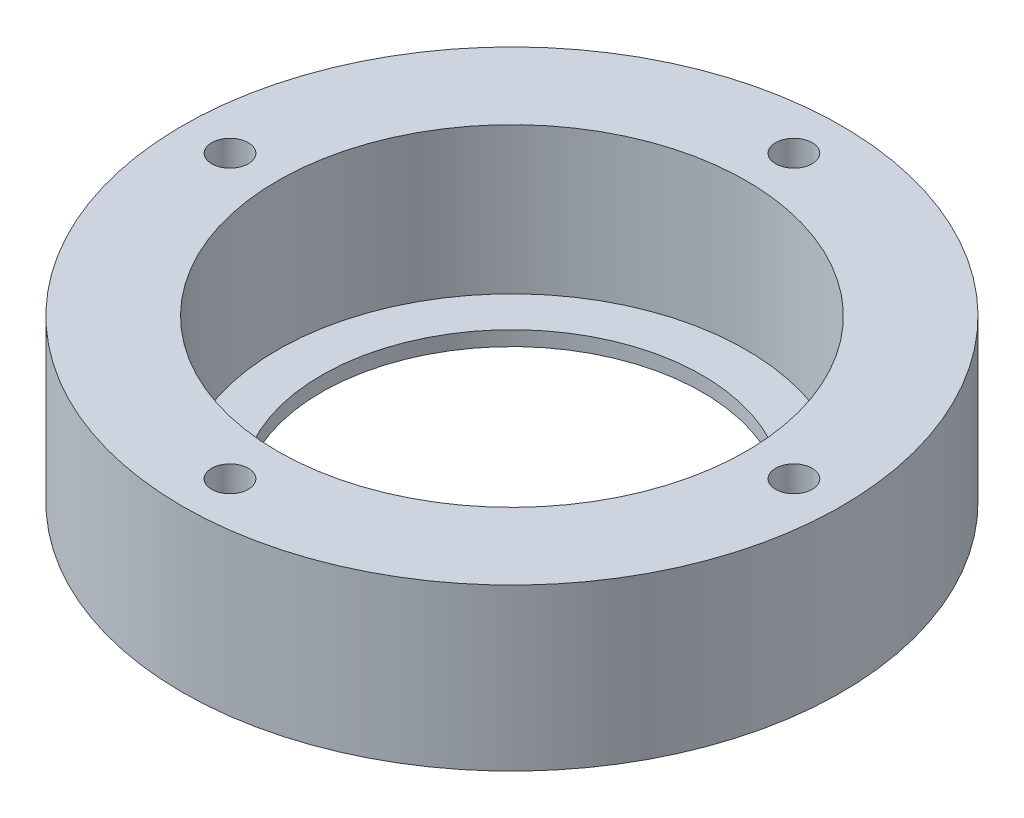
ISO-10303-21;
HEADER;
FILE_DESCRIPTION(('STEP AP214'),'2;1');
FILE_NAME('part.step','',(''),(''),'','','');
FILE_SCHEMA(('AUTOMOTIVE_DESIGN { 1 0 10303 214 1 1 1 1 }'));
ENDSEC;
DATA;
#1=APPLICATION_CONTEXT('core data for automotive mechanical design processes');
#2=APPLICATION_PROTOCOL_DEFINITION('international standard','automotive_design',2000,#1);
#3=PRODUCT_CONTEXT('',#1,'mechanical');
#4=PRODUCT('Part','Part','',(#3));
#5=PRODUCT_RELATED_PRODUCT_CATEGORY('part','',(#4));
#6=PRODUCT_DEFINITION_FORMATION('','',#4);
#7=PRODUCT_DEFINITION_CONTEXT('part definition',#1,'design');
#8=PRODUCT_DEFINITION('design','',#6,#7);
#9=PRODUCT_DEFINITION_SHAPE('','',#8);
#10=(LENGTH_UNIT() NAMED_UNIT(*) SI_UNIT(.MILLI.,.METRE.));
#11=(NAMED_UNIT(*) PLANE_ANGLE_UNIT() SI_UNIT($,.RADIAN.));
#12=(NAMED_UNIT(*) SI_UNIT($,.STERADIAN.) SOLID_ANGLE_UNIT());
#13=UNCERTAINTY_MEASURE_WITH_UNIT(LENGTH_MEASURE(1.E-05),#10,'distance_accuracy_value','');
#14=(GEOMETRIC_REPRESENTATION_CONTEXT(3) GLOBAL_UNCERTAINTY_ASSIGNED_CONTEXT((#13)) GLOBAL_UNIT_ASSIGNED_CONTEXT((#10,
#11,#12)) REPRESENTATION_CONTEXT('',''));
#15=CARTESIAN_POINT('',(0.,0.,0.));
#16=DIRECTION('',(0.,0.,1.));
#17=DIRECTION('',(1.,0.,0.));
#18=AXIS2_PLACEMENT_3D('',#15,#16,#17);
#19=CARTESIAN_POINT('',(0.,11.,0.));
#20=DIRECTION('',(0.,-1.,0.));
#21=DIRECTION('',(0.,0.,-1.));
#22=AXIS2_PLACEMENT_3D('',#19,#20,#21);
#23=CYLINDRICAL_SURFACE('',#22,22.5);
#24=CARTESIAN_POINT('',(0.,11.,0.));
#25=DIRECTION('',(0.,1.,0.));
#26=DIRECTION('',(0.,0.,1.));
#27=AXIS2_PLACEMENT_3D('',#24,#25,#26);
#28=CIRCLE('',#27,22.5);
#29=CARTESIAN_POINT('',(0.,11.,22.5));
#30=VERTEX_POINT('',#29);
#31=EDGE_CURVE('E11',#30,#30,#28,.T.);
#32=ORIENTED_EDGE('',*,*,#31,.F.);
#33=EDGE_LOOP('',(#32));
#34=FACE_BOUND('',#33,.T.);
#35=CARTESIAN_POINT('',(0.,0.,0.));
#36=DIRECTION('',(0.,1.,0.));
#37=DIRECTION('',(0.,0.,1.));
#38=AXIS2_PLACEMENT_3D('',#35,#36,#37);
#39=CIRCLE('',#38,22.5);
#40=CARTESIAN_POINT('',(0.,0.,22.5));
#41=VERTEX_POINT('',#40);
#42=EDGE_CURVE('E39',#41,#41,#39,.T.);
#43=ORIENTED_EDGE('',*,*,#42,.T.);
#44=EDGE_LOOP('',(#43));
#45=FACE_BOUND('',#44,.T.);
#46=ADVANCED_FACE('F36',(#34,#45),#23,.T.);
#47=CARTESIAN_POINT('',(0.,11.,0.));
#48=DIRECTION('',(0.,1.,0.));
#49=DIRECTION('',(0.,0.,1.));
#50=AXIS2_PLACEMENT_3D('',#47,#48,#49);
#51=PLANE('',#50);
#52=CARTESIAN_POINT('',(-19.25,11.,0.));
#53=DIRECTION('',(0.,1.,0.));
#54=DIRECTION('',(0.,0.,1.));
#55=AXIS2_PLACEMENT_3D('',#52,#53,#54);
#56=CIRCLE('',#55,1.25);
#57=CARTESIAN_POINT('',(-19.25,11.,1.25));
#58=VERTEX_POINT('',#57);
#59=EDGE_CURVE('E67',#58,#58,#56,.T.);
#60=ORIENTED_EDGE('',*,*,#59,.F.);
#61=EDGE_LOOP('',(#60));
#62=FACE_BOUND('',#61,.T.);
#63=CARTESIAN_POINT('',(0.,11.,19.25));
#64=DIRECTION('',(0.,1.,0.));
#65=DIRECTION('',(0.,0.,1.));
#66=AXIS2_PLACEMENT_3D('',#63,#64,#65);
#67=CIRCLE('',#66,1.25);
#68=CARTESIAN_POINT('',(0.,11.,20.5));
#69=VERTEX_POINT('',#68);
#70=EDGE_CURVE('E66',#69,#69,#67,.T.);
#71=ORIENTED_EDGE('',*,*,#70,.F.);
#72=EDGE_LOOP('',(#71));
#73=FACE_BOUND('',#72,.T.);
#74=CARTESIAN_POINT('',(19.25,11.,0.));
#75=DIRECTION('',(0.,1.,0.));
#76=DIRECTION('',(0.,0.,1.));
#77=AXIS2_PLACEMENT_3D('',#74,#75,#76);
#78=CIRCLE('',#77,1.25);
#79=CARTESIAN_POINT('',(19.25,11.,1.25));
#80=VERTEX_POINT('',#79);
#81=EDGE_CURVE('E77',#80,#80,#78,.T.);
#82=ORIENTED_EDGE('',*,*,#81,.F.);
#83=EDGE_LOOP('',(#82));
#84=FACE_BOUND('',#83,.T.);
#85=CARTESIAN_POINT('',(0.,11.,-19.25));
#86=DIRECTION('',(0.,1.,0.));
#87=DIRECTION('',(0.,0.,1.));
#88=AXIS2_PLACEMENT_3D('',#85,#86,#87);
#89=CIRCLE('',#88,1.25);
#90=CARTESIAN_POINT('',(0.,11.,-18.));
#91=VERTEX_POINT('',#90);
#92=EDGE_CURVE('E83',#91,#91,#89,.T.);
#93=ORIENTED_EDGE('',*,*,#92,.F.);
#94=EDGE_LOOP('',(#93));
#95=FACE_BOUND('',#94,.T.);
#96=CARTESIAN_POINT('',(0.,11.,0.));
#97=DIRECTION('',(0.,1.,0.));
#98=DIRECTION('',(0.,0.,1.));
#99=AXIS2_PLACEMENT_3D('',#96,#97,#98);
#100=CIRCLE('',#99,16.);
#101=CARTESIAN_POINT('',(0.,11.,16.));
#102=VERTEX_POINT('',#101);
#103=EDGE_CURVE('E93',#102,#102,#100,.T.);
#104=ORIENTED_EDGE('',*,*,#103,.F.);
#105=EDGE_LOOP('',(#104));
#106=FACE_BOUND('',#105,.T.);
#107=ORIENTED_EDGE('',*,*,#31,.T.);
#108=EDGE_LOOP('',(#107));
#109=FACE_BOUND('',#108,.T.);
#110=ADVANCED_FACE('F104',(#62,#73,#84,#95,#106,#109),#51,.T.);
#111=CARTESIAN_POINT('',(0.,0.,0.));
#112=DIRECTION('',(0.,1.,0.));
#113=DIRECTION('',(0.,0.,1.));
#114=AXIS2_PLACEMENT_3D('',#111,#112,#113);
#115=PLANE('',#114);
#116=CARTESIAN_POINT('',(0.,0.,0.));
#117=DIRECTION('',(0.,1.,0.));
#118=DIRECTION('',(0.,0.,1.));
#119=AXIS2_PLACEMENT_3D('',#116,#117,#118);
#120=CIRCLE('',#119,13.);
#121=CARTESIAN_POINT('',(0.,0.,13.));
#122=VERTEX_POINT('',#121);
#123=EDGE_CURVE('E90',#122,#122,#120,.T.);
#124=ORIENTED_EDGE('',*,*,#123,.T.);
#125=EDGE_LOOP('',(#124));
#126=FACE_BOUND('',#125,.T.);
#127=ORIENTED_EDGE('',*,*,#42,.F.);
#128=EDGE_LOOP('',(#127));
#129=FACE_BOUND('',#128,.T.);
#130=ADVANCED_FACE('F107',(#126,#129),#115,.F.);
#131=CARTESIAN_POINT('',(0.,0.999999999999999,0.));
#132=DIRECTION('',(0.,1.,0.));
#133=DIRECTION('',(0.,0.,1.));
#134=AXIS2_PLACEMENT_3D('',#131,#132,#133);
#135=CYLINDRICAL_SURFACE('',#134,16.);
#136=CARTESIAN_POINT('',(0.,0.999999999999999,0.));
#137=DIRECTION('',(0.,1.,0.));
#138=DIRECTION('',(0.,0.,1.));
#139=AXIS2_PLACEMENT_3D('',#136,#137,#138);
#140=CIRCLE('',#139,16.);
#141=CARTESIAN_POINT('',(0.,0.999999999999999,16.));
#142=VERTEX_POINT('',#141);
#143=EDGE_CURVE('E96',#142,#142,#140,.T.);
#144=ORIENTED_EDGE('',*,*,#143,.F.);
#145=EDGE_LOOP('',(#144));
#146=FACE_BOUND('',#145,.T.);
#147=ORIENTED_EDGE('',*,*,#103,.T.);
#148=EDGE_LOOP('',(#147));
#149=FACE_BOUND('',#148,.T.);
#150=ADVANCED_FACE('F102',(#146,#149),#135,.F.);
#151=CARTESIAN_POINT('',(0.,0.999999999999999,0.));
#152=DIRECTION('',(0.,1.,0.));
#153=DIRECTION('',(0.,0.,1.));
#154=AXIS2_PLACEMENT_3D('',#151,#152,#153);
#155=PLANE('',#154);
#156=CARTESIAN_POINT('',(0.,0.999999999999999,0.));
#157=DIRECTION('',(0.,1.,0.));
#158=DIRECTION('',(0.,0.,1.));
#159=AXIS2_PLACEMENT_3D('',#156,#157,#158);
#160=CIRCLE('',#159,13.);
#161=CARTESIAN_POINT('',(0.,0.999999999999999,13.));
#162=VERTEX_POINT('',#161);
#163=EDGE_CURVE('E89',#162,#162,#160,.T.);
#164=ORIENTED_EDGE('',*,*,#163,.F.);
#165=EDGE_LOOP('',(#164));
#166=FACE_BOUND('',#165,.T.);
#167=ORIENTED_EDGE('',*,*,#143,.T.);
#168=EDGE_LOOP('',(#167));
#169=FACE_BOUND('',#168,.T.);
#170=ADVANCED_FACE('F122',(#166,#169),#155,.T.);
#171=CARTESIAN_POINT('',(0.,0.,0.));
#172=DIRECTION('',(0.,1.,0.));
#173=DIRECTION('',(0.,0.,1.));
#174=AXIS2_PLACEMENT_3D('',#171,#172,#173);
#175=CYLINDRICAL_SURFACE('',#174,13.);
#176=ORIENTED_EDGE('',*,*,#123,.F.);
#177=EDGE_LOOP('',(#176));
#178=FACE_BOUND('',#177,.T.);
#179=ORIENTED_EDGE('',*,*,#163,.T.);
#180=EDGE_LOOP('',(#179));
#181=FACE_BOUND('',#180,.T.);
#182=ADVANCED_FACE('F128',(#178,#181),#175,.F.);
#183=CARTESIAN_POINT('',(0.,2.5,-19.25));
#184=DIRECTION('',(0.,1.,0.));
#185=DIRECTION('',(0.,0.,1.));
#186=AXIS2_PLACEMENT_3D('',#183,#184,#185);
#187=CONICAL_SURFACE('',#186,1.25,1.02974425867665);
#188=CARTESIAN_POINT('',(0.,1.74892422621555,-19.25));
#189=VERTEX_POINT('',#188);
#190=VERTEX_LOOP('',#189);
#191=FACE_BOUND('',#190,.T.);
#192=CARTESIAN_POINT('',(0.,2.5,-19.25));
#193=DIRECTION('',(0.,1.,0.));
#194=DIRECTION('',(0.,0.,1.));
#195=AXIS2_PLACEMENT_3D('',#192,#193,#194);
#196=CIRCLE('',#195,1.25);
#197=CARTESIAN_POINT('',(0.,2.5,-18.));
#198=VERTEX_POINT('',#197);
#199=EDGE_CURVE('E86',#198,#198,#196,.T.);
#200=ORIENTED_EDGE('',*,*,#199,.T.);
#201=EDGE_LOOP('',(#200));
#202=FACE_BOUND('',#201,.T.);
#203=ADVANCED_FACE('F132',(#191,#202),#187,.F.);
#204=CARTESIAN_POINT('',(0.,11.,-19.25));
#205=DIRECTION('',(0.,1.,0.));
#206=DIRECTION('',(0.,0.,1.));
#207=AXIS2_PLACEMENT_3D('',#204,#205,#206);
#208=CYLINDRICAL_SURFACE('',#207,1.25);
#209=ORIENTED_EDGE('',*,*,#199,.F.);
#210=EDGE_LOOP('',(#209));
#211=FACE_BOUND('',#210,.T.);
#212=ORIENTED_EDGE('',*,*,#92,.T.);
#213=EDGE_LOOP('',(#212));
#214=FACE_BOUND('',#213,.T.);
#215=ADVANCED_FACE('F136',(#211,#214),#208,.F.);
#216=CARTESIAN_POINT('',(19.25,2.5,0.));
#217=DIRECTION('',(0.,1.,0.));
#218=DIRECTION('',(0.,0.,1.));
#219=AXIS2_PLACEMENT_3D('',#216,#217,#218);
#220=CONICAL_SURFACE('',#219,1.25,1.02974425867665);
#221=CARTESIAN_POINT('',(19.25,1.74892422621555,0.));
#222=VERTEX_POINT('',#221);
#223=VERTEX_LOOP('',#222);
#224=FACE_BOUND('',#223,.T.);
#225=CARTESIAN_POINT('',(19.25,2.5,0.));
#226=DIRECTION('',(0.,1.,0.));
#227=DIRECTION('',(0.,0.,1.));
#228=AXIS2_PLACEMENT_3D('',#225,#226,#227);
#229=CIRCLE('',#228,1.25);
#230=CARTESIAN_POINT('',(19.25,2.5,1.25));
#231=VERTEX_POINT('',#230);
#232=EDGE_CURVE('E80',#231,#231,#229,.T.);
#233=ORIENTED_EDGE('',*,*,#232,.T.);
#234=EDGE_LOOP('',(#233));
#235=FACE_BOUND('',#234,.T.);
#236=ADVANCED_FACE('F139',(#224,#235),#220,.F.);
#237=CARTESIAN_POINT('',(19.25,11.,0.));
#238=DIRECTION('',(0.,1.,0.));
#239=DIRECTION('',(0.,0.,1.));
#240=AXIS2_PLACEMENT_3D('',#237,#238,#239);
#241=CYLINDRICAL_SURFACE('',#240,1.25);
#242=ORIENTED_EDGE('',*,*,#232,.F.);
#243=EDGE_LOOP('',(#242));
#244=FACE_BOUND('',#243,.T.);
#245=ORIENTED_EDGE('',*,*,#81,.T.);
#246=EDGE_LOOP('',(#245));
#247=FACE_BOUND('',#246,.T.);
#248=ADVANCED_FACE('F143',(#244,#247),#241,.F.);
#249=CARTESIAN_POINT('',(0.,2.5,19.25));
#250=DIRECTION('',(0.,1.,0.));
#251=DIRECTION('',(0.,0.,1.));
#252=AXIS2_PLACEMENT_3D('',#249,#250,#251);
#253=CONICAL_SURFACE('',#252,1.25,1.02974425867665);
#254=CARTESIAN_POINT('',(0.,1.74892422621555,19.25));
#255=VERTEX_POINT('',#254);
#256=VERTEX_LOOP('',#255);
#257=FACE_BOUND('',#256,.T.);
#258=CARTESIAN_POINT('',(0.,2.5,19.25));
#259=DIRECTION('',(0.,1.,0.));
#260=DIRECTION('',(0.,0.,1.));
#261=AXIS2_PLACEMENT_3D('',#258,#259,#260);
#262=CIRCLE('',#261,1.25);
#263=CARTESIAN_POINT('',(0.,2.5,20.5));
#264=VERTEX_POINT('',#263);
#265=EDGE_CURVE('E70',#264,#264,#262,.T.);
#266=ORIENTED_EDGE('',*,*,#265,.T.);
#267=EDGE_LOOP('',(#266));
#268=FACE_BOUND('',#267,.T.);
#269=ADVANCED_FACE('F146',(#257,#268),#253,.F.);
#270=CARTESIAN_POINT('',(0.,11.,19.25));
#271=DIRECTION('',(0.,1.,0.));
#272=DIRECTION('',(0.,0.,1.));
#273=AXIS2_PLACEMENT_3D('',#270,#271,#272);
#274=CYLINDRICAL_SURFACE('',#273,1.25);
#275=ORIENTED_EDGE('',*,*,#265,.F.);
#276=EDGE_LOOP('',(#275));
#277=FACE_BOUND('',#276,.T.);
#278=ORIENTED_EDGE('',*,*,#70,.T.);
#279=EDGE_LOOP('',(#278));
#280=FACE_BOUND('',#279,.T.);
#281=ADVANCED_FACE('F60',(#277,#280),#274,.F.);
#282=CARTESIAN_POINT('',(-19.25,2.5,0.));
#283=DIRECTION('',(0.,1.,0.));
#284=DIRECTION('',(0.,0.,1.));
#285=AXIS2_PLACEMENT_3D('',#282,#283,#284);
#286=CONICAL_SURFACE('',#285,1.25,1.02974425867665);
#287=CARTESIAN_POINT('',(-19.25,1.74892422621555,0.));
#288=VERTEX_POINT('',#287);
#289=VERTEX_LOOP('',#288);
#290=FACE_BOUND('',#289,.T.);
#291=CARTESIAN_POINT('',(-19.25,2.5,0.));
#292=DIRECTION('',(0.,1.,0.));
#293=DIRECTION('',(0.,0.,1.));
#294=AXIS2_PLACEMENT_3D('',#291,#292,#293);
#295=CIRCLE('',#294,1.25);
#296=CARTESIAN_POINT('',(-19.25,2.5,1.25));
#297=VERTEX_POINT('',#296);
#298=EDGE_CURVE('E64',#297,#297,#295,.T.);
#299=ORIENTED_EDGE('',*,*,#298,.T.);
#300=EDGE_LOOP('',(#299));
#301=FACE_BOUND('',#300,.T.);
#302=ADVANCED_FACE('F56',(#290,#301),#286,.F.);
#303=CARTESIAN_POINT('',(-19.25,11.,0.));
#304=DIRECTION('',(0.,1.,0.));
#305=DIRECTION('',(0.,0.,1.));
#306=AXIS2_PLACEMENT_3D('',#303,#304,#305);
#307=CYLINDRICAL_SURFACE('',#306,1.25);
#308=ORIENTED_EDGE('',*,*,#298,.F.);
#309=EDGE_LOOP('',(#308));
#310=FACE_BOUND('',#309,.T.);
#311=ORIENTED_EDGE('',*,*,#59,.T.);
#312=EDGE_LOOP('',(#311));
#313=FACE_BOUND('',#312,.T.);
#314=ADVANCED_FACE('F59',(#310,#313),#307,.F.);
#315=CLOSED_SHELL('',(#46,#110,#130,#150,#170,#182,#203,#215,#236,#248,#269,#281,#302,#314));
#316=MANIFOLD_SOLID_BREP('B2',#315);
#317=ADVANCED_BREP_SHAPE_REPRESENTATION('',(#18,#316),#14);
#318=SHAPE_DEFINITION_REPRESENTATION(#9,#317);
ENDSEC;
END-ISO-10303-21;
